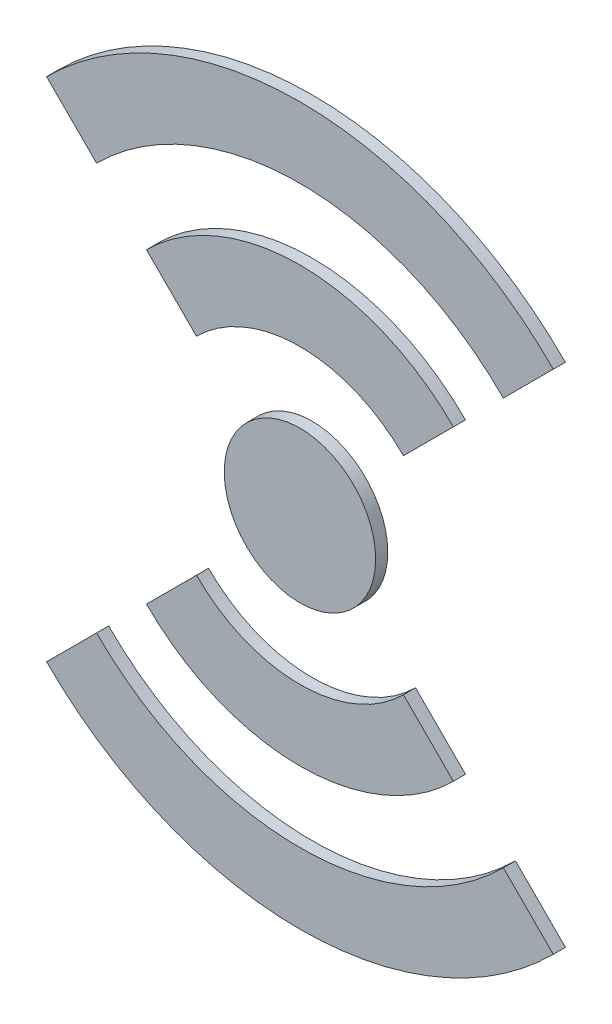
ISO-10303-21;
HEADER;
FILE_DESCRIPTION(('STEP AP214'),'2;1');
FILE_NAME('part.step','',(''),(''),'','','');
FILE_SCHEMA(('AUTOMOTIVE_DESIGN { 1 0 10303 214 1 1 1 1 }'));
ENDSEC;
DATA;
#1=APPLICATION_CONTEXT('core data for automotive mechanical design processes');
#2=APPLICATION_PROTOCOL_DEFINITION('international standard','automotive_design',2000,#1);
#3=PRODUCT_CONTEXT('',#1,'mechanical');
#4=PRODUCT('Part','Part','',(#3));
#5=PRODUCT_RELATED_PRODUCT_CATEGORY('part','',(#4));
#6=PRODUCT_DEFINITION_FORMATION('','',#4);
#7=PRODUCT_DEFINITION_CONTEXT('part definition',#1,'design');
#8=PRODUCT_DEFINITION('design','',#6,#7);
#9=PRODUCT_DEFINITION_SHAPE('','',#8);
#10=(LENGTH_UNIT() NAMED_UNIT(*) SI_UNIT(.MILLI.,.METRE.));
#11=(NAMED_UNIT(*) PLANE_ANGLE_UNIT() SI_UNIT($,.RADIAN.));
#12=(NAMED_UNIT(*) SI_UNIT($,.STERADIAN.) SOLID_ANGLE_UNIT());
#13=UNCERTAINTY_MEASURE_WITH_UNIT(LENGTH_MEASURE(1.E-05),#10,'distance_accuracy_value','');
#14=(GEOMETRIC_REPRESENTATION_CONTEXT(3) GLOBAL_UNCERTAINTY_ASSIGNED_CONTEXT((#13)) GLOBAL_UNIT_ASSIGNED_CONTEXT((#10,
#11,#12)) REPRESENTATION_CONTEXT('',''));
#15=CARTESIAN_POINT('',(0.,0.,0.));
#16=DIRECTION('',(0.,0.,1.));
#17=DIRECTION('',(1.,0.,0.));
#18=AXIS2_PLACEMENT_3D('',#15,#16,#17);
#19=CARTESIAN_POINT('',(0.,0.,1.2));
#20=DIRECTION('',(0.707106781186549,-0.707106781186546,0.));
#21=DIRECTION('',(0.707106781186546,0.707106781186549,0.));
#22=AXIS2_PLACEMENT_3D('',#19,#20,#21);
#23=PLANE('',#22);
#24=DIRECTION('',(-0.707106781186546,-0.707106781186549,0.));
#25=VECTOR('',#24,1.);
#26=CARTESIAN_POINT('',(0.,0.,0.));
#27=LINE('',#26,#25);
#28=CARTESIAN_POINT('',(-20.1525432638166,-20.1525432638166,0.));
#29=VERTEX_POINT('',#28);
#30=CARTESIAN_POINT('',(-25.1022907321224,-25.1022907321225,0.));
#31=VERTEX_POINT('',#30);
#32=EDGE_CURVE('E155',#29,#31,#27,.T.);
#33=ORIENTED_EDGE('',*,*,#32,.T.);
#34=DIRECTION('',(0.,0.,-1.));
#35=VECTOR('',#34,1.);
#36=CARTESIAN_POINT('',(-25.1022907321224,-25.1022907321225,1.2));
#37=LINE('',#36,#35);
#38=CARTESIAN_POINT('',(-25.1022907321224,-25.1022907321225,1.2));
#39=VERTEX_POINT('',#38);
#40=EDGE_CURVE('E13',#39,#31,#37,.T.);
#41=ORIENTED_EDGE('',*,*,#40,.F.);
#42=DIRECTION('',(-0.707106781186546,-0.707106781186549,0.));
#43=VECTOR('',#42,1.);
#44=CARTESIAN_POINT('',(0.,0.,1.2));
#45=LINE('',#44,#43);
#46=CARTESIAN_POINT('',(-20.1525432638166,-20.1525432638166,1.2));
#47=VERTEX_POINT('',#46);
#48=EDGE_CURVE('E141',#47,#39,#45,.T.);
#49=ORIENTED_EDGE('',*,*,#48,.F.);
#50=DIRECTION('',(0.,0.,-1.));
#51=VECTOR('',#50,1.);
#52=CARTESIAN_POINT('',(-20.1525432638166,-20.1525432638166,1.2));
#53=LINE('',#52,#51);
#54=EDGE_CURVE('E108',#47,#29,#53,.T.);
#55=ORIENTED_EDGE('',*,*,#54,.T.);
#56=EDGE_LOOP('',(#33,#41,#49,#55));
#57=FACE_BOUND('',#56,.T.);
#58=ADVANCED_FACE('F92',(#57),#23,.F.);
#59=CARTESIAN_POINT('',(0.,0.,1.2));
#60=DIRECTION('',(0.,0.,-1.));
#61=DIRECTION('',(-1.,0.,0.));
#62=AXIS2_PLACEMENT_3D('',#59,#60,#61);
#63=CYLINDRICAL_SURFACE('',#62,35.5);
#64=CARTESIAN_POINT('',(0.,0.,0.));
#65=DIRECTION('',(0.,0.,1.));
#66=DIRECTION('',(1.,0.,0.));
#67=AXIS2_PLACEMENT_3D('',#64,#65,#66);
#68=CIRCLE('',#67,35.5);
#69=CARTESIAN_POINT('',(25.1022907321226,-25.1022907321223,0.));
#70=VERTEX_POINT('',#69);
#71=EDGE_CURVE('E146',#31,#70,#68,.T.);
#72=ORIENTED_EDGE('',*,*,#71,.T.);
#73=DIRECTION('',(0.,0.,-1.));
#74=VECTOR('',#73,1.);
#75=CARTESIAN_POINT('',(25.1022907321226,-25.1022907321223,1.2));
#76=LINE('',#75,#74);
#77=CARTESIAN_POINT('',(25.1022907321226,-25.1022907321223,1.2));
#78=VERTEX_POINT('',#77);
#79=EDGE_CURVE('E100',#78,#70,#76,.T.);
#80=ORIENTED_EDGE('',*,*,#79,.F.);
#81=CARTESIAN_POINT('',(0.,0.,1.2));
#82=DIRECTION('',(0.,0.,1.));
#83=DIRECTION('',(1.,0.,0.));
#84=AXIS2_PLACEMENT_3D('',#81,#82,#83);
#85=CIRCLE('',#84,35.5);
#86=EDGE_CURVE('E133',#39,#78,#85,.T.);
#87=ORIENTED_EDGE('',*,*,#86,.F.);
#88=ORIENTED_EDGE('',*,*,#40,.T.);
#89=EDGE_LOOP('',(#72,#80,#87,#88));
#90=FACE_BOUND('',#89,.T.);
#91=ADVANCED_FACE('F145',(#90),#63,.T.);
#92=CARTESIAN_POINT('',(0.,0.,1.2));
#93=DIRECTION('',(0.707106781186544,0.707106781186551,0.));
#94=DIRECTION('',(-0.707106781186551,0.707106781186544,0.));
#95=AXIS2_PLACEMENT_3D('',#92,#93,#94);
#96=PLANE('',#95);
#97=DIRECTION('',(0.707106781186551,-0.707106781186544,0.));
#98=VECTOR('',#97,1.);
#99=CARTESIAN_POINT('',(0.,0.,0.));
#100=LINE('',#99,#98);
#101=CARTESIAN_POINT('',(20.1525432638167,-20.1525432638165,0.));
#102=VERTEX_POINT('',#101);
#103=EDGE_CURVE('E158',#102,#70,#100,.T.);
#104=ORIENTED_EDGE('',*,*,#103,.F.);
#105=DIRECTION('',(0.,0.,-1.));
#106=VECTOR('',#105,1.);
#107=CARTESIAN_POINT('',(20.1525432638167,-20.1525432638165,1.2));
#108=LINE('',#107,#106);
#109=CARTESIAN_POINT('',(20.1525432638167,-20.1525432638165,1.2));
#110=VERTEX_POINT('',#109);
#111=EDGE_CURVE('E122',#110,#102,#108,.T.);
#112=ORIENTED_EDGE('',*,*,#111,.F.);
#113=DIRECTION('',(0.707106781186551,-0.707106781186544,0.));
#114=VECTOR('',#113,1.);
#115=CARTESIAN_POINT('',(0.,0.,1.2));
#116=LINE('',#115,#114);
#117=EDGE_CURVE('E140',#110,#78,#116,.T.);
#118=ORIENTED_EDGE('',*,*,#117,.T.);
#119=ORIENTED_EDGE('',*,*,#79,.T.);
#120=EDGE_LOOP('',(#104,#112,#118,#119));
#121=FACE_BOUND('',#120,.T.);
#122=ADVANCED_FACE('F149',(#121),#96,.T.);
#123=CARTESIAN_POINT('',(0.,0.,1.2));
#124=DIRECTION('',(0.,0.,-1.));
#125=DIRECTION('',(-1.,0.,0.));
#126=AXIS2_PLACEMENT_3D('',#123,#124,#125);
#127=CYLINDRICAL_SURFACE('',#126,28.5);
#128=CARTESIAN_POINT('',(0.,0.,0.));
#129=DIRECTION('',(0.,0.,1.));
#130=DIRECTION('',(1.,0.,0.));
#131=AXIS2_PLACEMENT_3D('',#128,#129,#130);
#132=CIRCLE('',#131,28.5);
#133=EDGE_CURVE('E160',#29,#102,#132,.T.);
#134=ORIENTED_EDGE('',*,*,#133,.F.);
#135=ORIENTED_EDGE('',*,*,#54,.F.);
#136=CARTESIAN_POINT('',(0.,0.,1.2));
#137=DIRECTION('',(0.,0.,1.));
#138=DIRECTION('',(1.,0.,0.));
#139=AXIS2_PLACEMENT_3D('',#136,#137,#138);
#140=CIRCLE('',#139,28.5);
#141=EDGE_CURVE('E150',#47,#110,#140,.T.);
#142=ORIENTED_EDGE('',*,*,#141,.T.);
#143=ORIENTED_EDGE('',*,*,#111,.T.);
#144=EDGE_LOOP('',(#134,#135,#142,#143));
#145=FACE_BOUND('',#144,.T.);
#146=ADVANCED_FACE('F166',(#145),#127,.F.);
#147=CARTESIAN_POINT('',(0.,0.,1.2));
#148=DIRECTION('',(0.,0.,1.));
#149=DIRECTION('',(1.,0.,0.));
#150=AXIS2_PLACEMENT_3D('',#147,#148,#149);
#151=PLANE('',#150);
#152=ORIENTED_EDGE('',*,*,#48,.T.);
#153=ORIENTED_EDGE('',*,*,#86,.T.);
#154=ORIENTED_EDGE('',*,*,#117,.F.);
#155=ORIENTED_EDGE('',*,*,#141,.F.);
#156=EDGE_LOOP('',(#152,#153,#154,#155));
#157=FACE_BOUND('',#156,.T.);
#158=ADVANCED_FACE('F137',(#157),#151,.T.);
#159=CARTESIAN_POINT('',(0.,0.,0.));
#160=DIRECTION('',(0.,0.,1.));
#161=DIRECTION('',(1.,0.,0.));
#162=AXIS2_PLACEMENT_3D('',#159,#160,#161);
#163=PLANE('',#162);
#164=ORIENTED_EDGE('',*,*,#32,.F.);
#165=ORIENTED_EDGE('',*,*,#133,.T.);
#166=ORIENTED_EDGE('',*,*,#103,.T.);
#167=ORIENTED_EDGE('',*,*,#71,.F.);
#168=EDGE_LOOP('',(#164,#165,#166,#167));
#169=FACE_BOUND('',#168,.T.);
#170=ADVANCED_FACE('F165',(#169),#163,.F.);
#171=CLOSED_SHELL('',(#58,#91,#122,#146,#158,#170));
#172=MANIFOLD_SOLID_BREP('B2',#171);
#173=CARTESIAN_POINT('',(0.,0.,1.2));
#174=DIRECTION('',(-0.707106781186549,0.707106781186546,0.));
#175=DIRECTION('',(-0.707106781186546,-0.707106781186549,0.));
#176=AXIS2_PLACEMENT_3D('',#173,#174,#175);
#177=PLANE('',#176);
#178=DIRECTION('',(0.707106781186546,0.707106781186549,0.));
#179=VECTOR('',#178,1.);
#180=CARTESIAN_POINT('',(0.,0.,0.));
#181=LINE('',#180,#179);
#182=CARTESIAN_POINT('',(20.1525432638166,20.1525432638166,0.));
#183=VERTEX_POINT('',#182);
#184=CARTESIAN_POINT('',(25.1022907321224,25.1022907321225,0.));
#185=VERTEX_POINT('',#184);
#186=EDGE_CURVE('E289',#183,#185,#181,.T.);
#187=ORIENTED_EDGE('',*,*,#186,.T.);
#188=DIRECTION('',(0.,0.,-1.));
#189=VECTOR('',#188,1.);
#190=CARTESIAN_POINT('',(25.1022907321224,25.1022907321225,1.2));
#191=LINE('',#190,#189);
#192=CARTESIAN_POINT('',(25.1022907321224,25.1022907321225,1.2));
#193=VERTEX_POINT('',#192);
#194=EDGE_CURVE('E90',#193,#185,#191,.T.);
#195=ORIENTED_EDGE('',*,*,#194,.F.);
#196=DIRECTION('',(0.707106781186546,0.707106781186549,0.));
#197=VECTOR('',#196,1.);
#198=CARTESIAN_POINT('',(0.,0.,1.2));
#199=LINE('',#198,#197);
#200=CARTESIAN_POINT('',(20.1525432638166,20.1525432638166,1.2));
#201=VERTEX_POINT('',#200);
#202=EDGE_CURVE('E275',#201,#193,#199,.T.);
#203=ORIENTED_EDGE('',*,*,#202,.F.);
#204=DIRECTION('',(0.,0.,-1.));
#205=VECTOR('',#204,1.);
#206=CARTESIAN_POINT('',(20.1525432638166,20.1525432638166,1.2));
#207=LINE('',#206,#205);
#208=EDGE_CURVE('E242',#201,#183,#207,.T.);
#209=ORIENTED_EDGE('',*,*,#208,.T.);
#210=EDGE_LOOP('',(#187,#195,#203,#209));
#211=FACE_BOUND('',#210,.T.);
#212=ADVANCED_FACE('F226',(#211),#177,.F.);
#213=CARTESIAN_POINT('',(0.,0.,1.2));
#214=DIRECTION('',(0.,0.,-1.));
#215=DIRECTION('',(-1.,0.,0.));
#216=AXIS2_PLACEMENT_3D('',#213,#214,#215);
#217=CYLINDRICAL_SURFACE('',#216,35.5);
#218=CARTESIAN_POINT('',(0.,0.,0.));
#219=DIRECTION('',(0.,0.,1.));
#220=DIRECTION('',(1.,0.,0.));
#221=AXIS2_PLACEMENT_3D('',#218,#219,#220);
#222=CIRCLE('',#221,35.5);
#223=CARTESIAN_POINT('',(-25.1022907321226,25.1022907321223,0.));
#224=VERTEX_POINT('',#223);
#225=EDGE_CURVE('E280',#185,#224,#222,.T.);
#226=ORIENTED_EDGE('',*,*,#225,.T.);
#227=DIRECTION('',(0.,0.,-1.));
#228=VECTOR('',#227,1.);
#229=CARTESIAN_POINT('',(-25.1022907321226,25.1022907321223,1.2));
#230=LINE('',#229,#228);
#231=CARTESIAN_POINT('',(-25.1022907321226,25.1022907321223,1.2));
#232=VERTEX_POINT('',#231);
#233=EDGE_CURVE('E234',#232,#224,#230,.T.);
#234=ORIENTED_EDGE('',*,*,#233,.F.);
#235=CARTESIAN_POINT('',(0.,0.,1.2));
#236=DIRECTION('',(0.,0.,1.));
#237=DIRECTION('',(1.,0.,0.));
#238=AXIS2_PLACEMENT_3D('',#235,#236,#237);
#239=CIRCLE('',#238,35.5);
#240=EDGE_CURVE('E267',#193,#232,#239,.T.);
#241=ORIENTED_EDGE('',*,*,#240,.F.);
#242=ORIENTED_EDGE('',*,*,#194,.T.);
#243=EDGE_LOOP('',(#226,#234,#241,#242));
#244=FACE_BOUND('',#243,.T.);
#245=ADVANCED_FACE('F279',(#244),#217,.T.);
#246=CARTESIAN_POINT('',(0.,0.,1.2));
#247=DIRECTION('',(-0.707106781186544,-0.707106781186551,0.));
#248=DIRECTION('',(0.707106781186551,-0.707106781186544,0.));
#249=AXIS2_PLACEMENT_3D('',#246,#247,#248);
#250=PLANE('',#249);
#251=DIRECTION('',(-0.707106781186551,0.707106781186544,0.));
#252=VECTOR('',#251,1.);
#253=CARTESIAN_POINT('',(0.,0.,0.));
#254=LINE('',#253,#252);
#255=CARTESIAN_POINT('',(-20.1525432638167,20.1525432638165,0.));
#256=VERTEX_POINT('',#255);
#257=EDGE_CURVE('E292',#256,#224,#254,.T.);
#258=ORIENTED_EDGE('',*,*,#257,.F.);
#259=DIRECTION('',(0.,0.,-1.));
#260=VECTOR('',#259,1.);
#261=CARTESIAN_POINT('',(-20.1525432638167,20.1525432638165,1.2));
#262=LINE('',#261,#260);
#263=CARTESIAN_POINT('',(-20.1525432638167,20.1525432638165,1.2));
#264=VERTEX_POINT('',#263);
#265=EDGE_CURVE('E256',#264,#256,#262,.T.);
#266=ORIENTED_EDGE('',*,*,#265,.F.);
#267=DIRECTION('',(-0.707106781186551,0.707106781186544,0.));
#268=VECTOR('',#267,1.);
#269=CARTESIAN_POINT('',(0.,0.,1.2));
#270=LINE('',#269,#268);
#271=EDGE_CURVE('E274',#264,#232,#270,.T.);
#272=ORIENTED_EDGE('',*,*,#271,.T.);
#273=ORIENTED_EDGE('',*,*,#233,.T.);
#274=EDGE_LOOP('',(#258,#266,#272,#273));
#275=FACE_BOUND('',#274,.T.);
#276=ADVANCED_FACE('F283',(#275),#250,.T.);
#277=CARTESIAN_POINT('',(0.,0.,1.2));
#278=DIRECTION('',(0.,0.,-1.));
#279=DIRECTION('',(-1.,0.,0.));
#280=AXIS2_PLACEMENT_3D('',#277,#278,#279);
#281=CYLINDRICAL_SURFACE('',#280,28.5);
#282=CARTESIAN_POINT('',(0.,0.,0.));
#283=DIRECTION('',(0.,0.,1.));
#284=DIRECTION('',(1.,0.,0.));
#285=AXIS2_PLACEMENT_3D('',#282,#283,#284);
#286=CIRCLE('',#285,28.5);
#287=EDGE_CURVE('E294',#183,#256,#286,.T.);
#288=ORIENTED_EDGE('',*,*,#287,.F.);
#289=ORIENTED_EDGE('',*,*,#208,.F.);
#290=CARTESIAN_POINT('',(0.,0.,1.2));
#291=DIRECTION('',(0.,0.,1.));
#292=DIRECTION('',(1.,0.,0.));
#293=AXIS2_PLACEMENT_3D('',#290,#291,#292);
#294=CIRCLE('',#293,28.5);
#295=EDGE_CURVE('E284',#201,#264,#294,.T.);
#296=ORIENTED_EDGE('',*,*,#295,.T.);
#297=ORIENTED_EDGE('',*,*,#265,.T.);
#298=EDGE_LOOP('',(#288,#289,#296,#297));
#299=FACE_BOUND('',#298,.T.);
#300=ADVANCED_FACE('F300',(#299),#281,.F.);
#301=CARTESIAN_POINT('',(0.,0.,1.2));
#302=DIRECTION('',(0.,0.,1.));
#303=DIRECTION('',(1.,0.,0.));
#304=AXIS2_PLACEMENT_3D('',#301,#302,#303);
#305=PLANE('',#304);
#306=ORIENTED_EDGE('',*,*,#202,.T.);
#307=ORIENTED_EDGE('',*,*,#240,.T.);
#308=ORIENTED_EDGE('',*,*,#271,.F.);
#309=ORIENTED_EDGE('',*,*,#295,.F.);
#310=EDGE_LOOP('',(#306,#307,#308,#309));
#311=FACE_BOUND('',#310,.T.);
#312=ADVANCED_FACE('F271',(#311),#305,.T.);
#313=CARTESIAN_POINT('',(0.,0.,0.));
#314=DIRECTION('',(0.,0.,1.));
#315=DIRECTION('',(1.,0.,0.));
#316=AXIS2_PLACEMENT_3D('',#313,#314,#315);
#317=PLANE('',#316);
#318=ORIENTED_EDGE('',*,*,#186,.F.);
#319=ORIENTED_EDGE('',*,*,#287,.T.);
#320=ORIENTED_EDGE('',*,*,#257,.T.);
#321=ORIENTED_EDGE('',*,*,#225,.F.);
#322=EDGE_LOOP('',(#318,#319,#320,#321));
#323=FACE_BOUND('',#322,.T.);
#324=ADVANCED_FACE('F299',(#323),#317,.F.);
#325=CLOSED_SHELL('',(#212,#245,#276,#300,#312,#324));
#326=MANIFOLD_SOLID_BREP('B7',#325);
#327=CARTESIAN_POINT('',(0.,0.,1.2));
#328=DIRECTION('',(0.707106781186549,-0.707106781186546,0.));
#329=DIRECTION('',(0.707106781186546,0.707106781186549,0.));
#330=AXIS2_PLACEMENT_3D('',#327,#328,#329);
#331=PLANE('',#330);
#332=DIRECTION('',(-0.707106781186546,-0.707106781186549,0.));
#333=VECTOR('',#332,1.);
#334=CARTESIAN_POINT('',(0.,0.,0.));
#335=LINE('',#334,#333);
#336=CARTESIAN_POINT('',(-10.2530483272049,-10.253048327205,0.));
#337=VERTEX_POINT('',#336);
#338=CARTESIAN_POINT('',(-15.2027957955107,-15.2027957955108,0.));
#339=VERTEX_POINT('',#338);
#340=EDGE_CURVE('E429',#337,#339,#335,.T.);
#341=ORIENTED_EDGE('',*,*,#340,.T.);
#342=DIRECTION('',(0.,0.,-1.));
#343=VECTOR('',#342,1.);
#344=CARTESIAN_POINT('',(-15.2027957955107,-15.2027957955108,1.2));
#345=LINE('',#344,#343);
#346=CARTESIAN_POINT('',(-15.2027957955107,-15.2027957955108,1.2));
#347=VERTEX_POINT('',#346);
#348=EDGE_CURVE('E224',#347,#339,#345,.T.);
#349=ORIENTED_EDGE('',*,*,#348,.F.);
#350=DIRECTION('',(-0.707106781186546,-0.707106781186549,0.));
#351=VECTOR('',#350,1.);
#352=CARTESIAN_POINT('',(0.,0.,1.2));
#353=LINE('',#352,#351);
#354=CARTESIAN_POINT('',(-10.2530483272049,-10.253048327205,1.2));
#355=VERTEX_POINT('',#354);
#356=EDGE_CURVE('E415',#355,#347,#353,.T.);
#357=ORIENTED_EDGE('',*,*,#356,.F.);
#358=DIRECTION('',(0.,0.,-1.));
#359=VECTOR('',#358,1.);
#360=CARTESIAN_POINT('',(-10.2530483272049,-10.253048327205,1.2));
#361=LINE('',#360,#359);
#362=EDGE_CURVE('E382',#355,#337,#361,.T.);
#363=ORIENTED_EDGE('',*,*,#362,.T.);
#364=EDGE_LOOP('',(#341,#349,#357,#363));
#365=FACE_BOUND('',#364,.T.);
#366=ADVANCED_FACE('F366',(#365),#331,.F.);
#367=CARTESIAN_POINT('',(0.,0.,1.2));
#368=DIRECTION('',(0.,0.,-1.));
#369=DIRECTION('',(-1.,0.,0.));
#370=AXIS2_PLACEMENT_3D('',#367,#368,#369);
#371=CYLINDRICAL_SURFACE('',#370,21.5);
#372=CARTESIAN_POINT('',(0.,0.,0.));
#373=DIRECTION('',(0.,0.,1.));
#374=DIRECTION('',(1.,0.,0.));
#375=AXIS2_PLACEMENT_3D('',#372,#373,#374);
#376=CIRCLE('',#375,21.5);
#377=CARTESIAN_POINT('',(15.2027957955109,-15.2027957955107,0.));
#378=VERTEX_POINT('',#377);
#379=EDGE_CURVE('E420',#339,#378,#376,.T.);
#380=ORIENTED_EDGE('',*,*,#379,.T.);
#381=DIRECTION('',(0.,0.,-1.));
#382=VECTOR('',#381,1.);
#383=CARTESIAN_POINT('',(15.2027957955109,-15.2027957955107,1.2));
#384=LINE('',#383,#382);
#385=CARTESIAN_POINT('',(15.2027957955109,-15.2027957955107,1.2));
#386=VERTEX_POINT('',#385);
#387=EDGE_CURVE('E374',#386,#378,#384,.T.);
#388=ORIENTED_EDGE('',*,*,#387,.F.);
#389=CARTESIAN_POINT('',(0.,0.,1.2));
#390=DIRECTION('',(0.,0.,1.));
#391=DIRECTION('',(1.,0.,0.));
#392=AXIS2_PLACEMENT_3D('',#389,#390,#391);
#393=CIRCLE('',#392,21.5);
#394=EDGE_CURVE('E407',#347,#386,#393,.T.);
#395=ORIENTED_EDGE('',*,*,#394,.F.);
#396=ORIENTED_EDGE('',*,*,#348,.T.);
#397=EDGE_LOOP('',(#380,#388,#395,#396));
#398=FACE_BOUND('',#397,.T.);
#399=ADVANCED_FACE('F419',(#398),#371,.T.);
#400=CARTESIAN_POINT('',(0.,0.,1.2));
#401=DIRECTION('',(0.707106781186544,0.707106781186551,0.));
#402=DIRECTION('',(-0.707106781186551,0.707106781186544,0.));
#403=AXIS2_PLACEMENT_3D('',#400,#401,#402);
#404=PLANE('',#403);
#405=DIRECTION('',(0.707106781186551,-0.707106781186544,0.));
#406=VECTOR('',#405,1.);
#407=CARTESIAN_POINT('',(0.,0.,0.));
#408=LINE('',#407,#406);
#409=CARTESIAN_POINT('',(10.253048327205,-10.2530483272049,0.));
#410=VERTEX_POINT('',#409);
#411=EDGE_CURVE('E432',#410,#378,#408,.T.);
#412=ORIENTED_EDGE('',*,*,#411,.F.);
#413=DIRECTION('',(0.,0.,-1.));
#414=VECTOR('',#413,1.);
#415=CARTESIAN_POINT('',(10.253048327205,-10.2530483272049,1.2));
#416=LINE('',#415,#414);
#417=CARTESIAN_POINT('',(10.253048327205,-10.2530483272049,1.2));
#418=VERTEX_POINT('',#417);
#419=EDGE_CURVE('E396',#418,#410,#416,.T.);
#420=ORIENTED_EDGE('',*,*,#419,.F.);
#421=DIRECTION('',(0.707106781186551,-0.707106781186544,0.));
#422=VECTOR('',#421,1.);
#423=CARTESIAN_POINT('',(0.,0.,1.2));
#424=LINE('',#423,#422);
#425=EDGE_CURVE('E414',#418,#386,#424,.T.);
#426=ORIENTED_EDGE('',*,*,#425,.T.);
#427=ORIENTED_EDGE('',*,*,#387,.T.);
#428=EDGE_LOOP('',(#412,#420,#426,#427));
#429=FACE_BOUND('',#428,.T.);
#430=ADVANCED_FACE('F423',(#429),#404,.T.);
#431=CARTESIAN_POINT('',(0.,0.,1.2));
#432=DIRECTION('',(0.,0.,-1.));
#433=DIRECTION('',(-1.,0.,0.));
#434=AXIS2_PLACEMENT_3D('',#431,#432,#433);
#435=CYLINDRICAL_SURFACE('',#434,14.5);
#436=CARTESIAN_POINT('',(0.,0.,0.));
#437=DIRECTION('',(0.,0.,1.));
#438=DIRECTION('',(1.,0.,0.));
#439=AXIS2_PLACEMENT_3D('',#436,#437,#438);
#440=CIRCLE('',#439,14.5);
#441=EDGE_CURVE('E434',#337,#410,#440,.T.);
#442=ORIENTED_EDGE('',*,*,#441,.F.);
#443=ORIENTED_EDGE('',*,*,#362,.F.);
#444=CARTESIAN_POINT('',(0.,0.,1.2));
#445=DIRECTION('',(0.,0.,1.));
#446=DIRECTION('',(1.,0.,0.));
#447=AXIS2_PLACEMENT_3D('',#444,#445,#446);
#448=CIRCLE('',#447,14.5);
#449=EDGE_CURVE('E424',#355,#418,#448,.T.);
#450=ORIENTED_EDGE('',*,*,#449,.T.);
#451=ORIENTED_EDGE('',*,*,#419,.T.);
#452=EDGE_LOOP('',(#442,#443,#450,#451));
#453=FACE_BOUND('',#452,.T.);
#454=ADVANCED_FACE('F440',(#453),#435,.F.);
#455=CARTESIAN_POINT('',(0.,0.,1.2));
#456=DIRECTION('',(0.,0.,1.));
#457=DIRECTION('',(1.,0.,0.));
#458=AXIS2_PLACEMENT_3D('',#455,#456,#457);
#459=PLANE('',#458);
#460=ORIENTED_EDGE('',*,*,#356,.T.);
#461=ORIENTED_EDGE('',*,*,#394,.T.);
#462=ORIENTED_EDGE('',*,*,#425,.F.);
#463=ORIENTED_EDGE('',*,*,#449,.F.);
#464=EDGE_LOOP('',(#460,#461,#462,#463));
#465=FACE_BOUND('',#464,.T.);
#466=ADVANCED_FACE('F411',(#465),#459,.T.);
#467=CARTESIAN_POINT('',(0.,0.,0.));
#468=DIRECTION('',(0.,0.,1.));
#469=DIRECTION('',(1.,0.,0.));
#470=AXIS2_PLACEMENT_3D('',#467,#468,#469);
#471=PLANE('',#470);
#472=ORIENTED_EDGE('',*,*,#340,.F.);
#473=ORIENTED_EDGE('',*,*,#441,.T.);
#474=ORIENTED_EDGE('',*,*,#411,.T.);
#475=ORIENTED_EDGE('',*,*,#379,.F.);
#476=EDGE_LOOP('',(#472,#473,#474,#475));
#477=FACE_BOUND('',#476,.T.);
#478=ADVANCED_FACE('F439',(#477),#471,.F.);
#479=CLOSED_SHELL('',(#366,#399,#430,#454,#466,#478));
#480=MANIFOLD_SOLID_BREP('B84',#479);
#481=CARTESIAN_POINT('',(0.,0.,1.2));
#482=DIRECTION('',(-0.707106781186549,0.707106781186546,0.));
#483=DIRECTION('',(-0.707106781186546,-0.707106781186549,0.));
#484=AXIS2_PLACEMENT_3D('',#481,#482,#483);
#485=PLANE('',#484);
#486=DIRECTION('',(0.707106781186546,0.707106781186549,0.));
#487=VECTOR('',#486,1.);
#488=CARTESIAN_POINT('',(0.,0.,0.));
#489=LINE('',#488,#487);
#490=CARTESIAN_POINT('',(10.2530483272049,10.253048327205,0.));
#491=VERTEX_POINT('',#490);
#492=CARTESIAN_POINT('',(15.2027957955107,15.2027957955108,0.));
#493=VERTEX_POINT('',#492);
#494=EDGE_CURVE('E560',#491,#493,#489,.T.);
#495=ORIENTED_EDGE('',*,*,#494,.T.);
#496=DIRECTION('',(0.,0.,-1.));
#497=VECTOR('',#496,1.);
#498=CARTESIAN_POINT('',(15.2027957955107,15.2027957955108,1.2));
#499=LINE('',#498,#497);
#500=CARTESIAN_POINT('',(15.2027957955107,15.2027957955108,1.2));
#501=VERTEX_POINT('',#500);
#502=EDGE_CURVE('E364',#501,#493,#499,.T.);
#503=ORIENTED_EDGE('',*,*,#502,.F.);
#504=DIRECTION('',(0.707106781186546,0.707106781186549,0.));
#505=VECTOR('',#504,1.);
#506=CARTESIAN_POINT('',(0.,0.,1.2));
#507=LINE('',#506,#505);
#508=CARTESIAN_POINT('',(10.2530483272049,10.253048327205,1.2));
#509=VERTEX_POINT('',#508);
#510=EDGE_CURVE('E546',#509,#501,#507,.T.);
#511=ORIENTED_EDGE('',*,*,#510,.F.);
#512=DIRECTION('',(0.,0.,-1.));
#513=VECTOR('',#512,1.);
#514=CARTESIAN_POINT('',(10.2530483272049,10.253048327205,1.2));
#515=LINE('',#514,#513);
#516=EDGE_CURVE('E513',#509,#491,#515,.T.);
#517=ORIENTED_EDGE('',*,*,#516,.T.);
#518=EDGE_LOOP('',(#495,#503,#511,#517));
#519=FACE_BOUND('',#518,.T.);
#520=ADVANCED_FACE('F497',(#519),#485,.F.);
#521=CARTESIAN_POINT('',(0.,0.,1.2));
#522=DIRECTION('',(0.,0.,-1.));
#523=DIRECTION('',(-1.,0.,0.));
#524=AXIS2_PLACEMENT_3D('',#521,#522,#523);
#525=CYLINDRICAL_SURFACE('',#524,21.5);
#526=CARTESIAN_POINT('',(0.,0.,0.));
#527=DIRECTION('',(0.,0.,1.));
#528=DIRECTION('',(1.,0.,0.));
#529=AXIS2_PLACEMENT_3D('',#526,#527,#528);
#530=CIRCLE('',#529,21.5);
#531=CARTESIAN_POINT('',(-15.2027957955109,15.2027957955107,0.));
#532=VERTEX_POINT('',#531);
#533=EDGE_CURVE('E551',#493,#532,#530,.T.);
#534=ORIENTED_EDGE('',*,*,#533,.T.);
#535=DIRECTION('',(0.,0.,-1.));
#536=VECTOR('',#535,1.);
#537=CARTESIAN_POINT('',(-15.2027957955109,15.2027957955107,1.2));
#538=LINE('',#537,#536);
#539=CARTESIAN_POINT('',(-15.2027957955109,15.2027957955107,1.2));
#540=VERTEX_POINT('',#539);
#541=EDGE_CURVE('E505',#540,#532,#538,.T.);
#542=ORIENTED_EDGE('',*,*,#541,.F.);
#543=CARTESIAN_POINT('',(0.,0.,1.2));
#544=DIRECTION('',(0.,0.,1.));
#545=DIRECTION('',(1.,0.,0.));
#546=AXIS2_PLACEMENT_3D('',#543,#544,#545);
#547=CIRCLE('',#546,21.5);
#548=EDGE_CURVE('E538',#501,#540,#547,.T.);
#549=ORIENTED_EDGE('',*,*,#548,.F.);
#550=ORIENTED_EDGE('',*,*,#502,.T.);
#551=EDGE_LOOP('',(#534,#542,#549,#550));
#552=FACE_BOUND('',#551,.T.);
#553=ADVANCED_FACE('F550',(#552),#525,.T.);
#554=CARTESIAN_POINT('',(0.,0.,1.2));
#555=DIRECTION('',(-0.707106781186544,-0.707106781186551,0.));
#556=DIRECTION('',(0.707106781186551,-0.707106781186544,0.));
#557=AXIS2_PLACEMENT_3D('',#554,#555,#556);
#558=PLANE('',#557);
#559=DIRECTION('',(-0.707106781186551,0.707106781186544,0.));
#560=VECTOR('',#559,1.);
#561=CARTESIAN_POINT('',(0.,0.,0.));
#562=LINE('',#561,#560);
#563=CARTESIAN_POINT('',(-10.253048327205,10.2530483272049,0.));
#564=VERTEX_POINT('',#563);
#565=EDGE_CURVE('E563',#564,#532,#562,.T.);
#566=ORIENTED_EDGE('',*,*,#565,.F.);
#567=DIRECTION('',(0.,0.,-1.));
#568=VECTOR('',#567,1.);
#569=CARTESIAN_POINT('',(-10.253048327205,10.2530483272049,1.2));
#570=LINE('',#569,#568);
#571=CARTESIAN_POINT('',(-10.253048327205,10.2530483272049,1.2));
#572=VERTEX_POINT('',#571);
#573=EDGE_CURVE('E527',#572,#564,#570,.T.);
#574=ORIENTED_EDGE('',*,*,#573,.F.);
#575=DIRECTION('',(-0.707106781186551,0.707106781186544,0.));
#576=VECTOR('',#575,1.);
#577=CARTESIAN_POINT('',(0.,0.,1.2));
#578=LINE('',#577,#576);
#579=EDGE_CURVE('E545',#572,#540,#578,.T.);
#580=ORIENTED_EDGE('',*,*,#579,.T.);
#581=ORIENTED_EDGE('',*,*,#541,.T.);
#582=EDGE_LOOP('',(#566,#574,#580,#581));
#583=FACE_BOUND('',#582,.T.);
#584=ADVANCED_FACE('F554',(#583),#558,.T.);
#585=CARTESIAN_POINT('',(0.,0.,1.2));
#586=DIRECTION('',(0.,0.,-1.));
#587=DIRECTION('',(-1.,0.,0.));
#588=AXIS2_PLACEMENT_3D('',#585,#586,#587);
#589=CYLINDRICAL_SURFACE('',#588,14.5);
#590=CARTESIAN_POINT('',(0.,0.,0.));
#591=DIRECTION('',(0.,0.,1.));
#592=DIRECTION('',(1.,0.,0.));
#593=AXIS2_PLACEMENT_3D('',#590,#591,#592);
#594=CIRCLE('',#593,14.5);
#595=EDGE_CURVE('E565',#491,#564,#594,.T.);
#596=ORIENTED_EDGE('',*,*,#595,.F.);
#597=ORIENTED_EDGE('',*,*,#516,.F.);
#598=CARTESIAN_POINT('',(0.,0.,1.2));
#599=DIRECTION('',(0.,0.,1.));
#600=DIRECTION('',(1.,0.,0.));
#601=AXIS2_PLACEMENT_3D('',#598,#599,#600);
#602=CIRCLE('',#601,14.5);
#603=EDGE_CURVE('E555',#509,#572,#602,.T.);
#604=ORIENTED_EDGE('',*,*,#603,.T.);
#605=ORIENTED_EDGE('',*,*,#573,.T.);
#606=EDGE_LOOP('',(#596,#597,#604,#605));
#607=FACE_BOUND('',#606,.T.);
#608=ADVANCED_FACE('F571',(#607),#589,.F.);
#609=CARTESIAN_POINT('',(0.,0.,1.2));
#610=DIRECTION('',(0.,0.,1.));
#611=DIRECTION('',(1.,0.,0.));
#612=AXIS2_PLACEMENT_3D('',#609,#610,#611);
#613=PLANE('',#612);
#614=ORIENTED_EDGE('',*,*,#510,.T.);
#615=ORIENTED_EDGE('',*,*,#548,.T.);
#616=ORIENTED_EDGE('',*,*,#579,.F.);
#617=ORIENTED_EDGE('',*,*,#603,.F.);
#618=EDGE_LOOP('',(#614,#615,#616,#617));
#619=FACE_BOUND('',#618,.T.);
#620=ADVANCED_FACE('F542',(#619),#613,.T.);
#621=CARTESIAN_POINT('',(0.,0.,0.));
#622=DIRECTION('',(0.,0.,1.));
#623=DIRECTION('',(1.,0.,0.));
#624=AXIS2_PLACEMENT_3D('',#621,#622,#623);
#625=PLANE('',#624);
#626=ORIENTED_EDGE('',*,*,#494,.F.);
#627=ORIENTED_EDGE('',*,*,#595,.T.);
#628=ORIENTED_EDGE('',*,*,#565,.T.);
#629=ORIENTED_EDGE('',*,*,#533,.F.);
#630=EDGE_LOOP('',(#626,#627,#628,#629));
#631=FACE_BOUND('',#630,.T.);
#632=ADVANCED_FACE('F570',(#631),#625,.F.);
#633=CLOSED_SHELL('',(#520,#553,#584,#608,#620,#632));
#634=MANIFOLD_SOLID_BREP('B218',#633);
#635=CARTESIAN_POINT('',(0.,0.,1.2));
#636=DIRECTION('',(0.,0.,-1.));
#637=DIRECTION('',(-1.,0.,0.));
#638=AXIS2_PLACEMENT_3D('',#635,#636,#637);
#639=CYLINDRICAL_SURFACE('',#638,7.5);
#640=CARTESIAN_POINT('',(0.,0.,1.2));
#641=DIRECTION('',(0.,0.,1.));
#642=DIRECTION('',(1.,0.,0.));
#643=AXIS2_PLACEMENT_3D('',#640,#641,#642);
#644=CIRCLE('',#643,7.5);
#645=CARTESIAN_POINT('',(7.5,0.,1.2));
#646=VERTEX_POINT('',#645);
#647=EDGE_CURVE('E496',#646,#646,#644,.T.);
#648=ORIENTED_EDGE('',*,*,#647,.F.);
#649=EDGE_LOOP('',(#648));
#650=FACE_BOUND('',#649,.T.);
#651=CARTESIAN_POINT('',(0.,0.,0.));
#652=DIRECTION('',(0.,0.,1.));
#653=DIRECTION('',(1.,0.,0.));
#654=AXIS2_PLACEMENT_3D('',#651,#652,#653);
#655=CIRCLE('',#654,7.5);
#656=CARTESIAN_POINT('',(7.5,0.,0.));
#657=VERTEX_POINT('',#656);
#658=EDGE_CURVE('E630',#657,#657,#655,.T.);
#659=ORIENTED_EDGE('',*,*,#658,.T.);
#660=EDGE_LOOP('',(#659));
#661=FACE_BOUND('',#660,.T.);
#662=ADVANCED_FACE('F627',(#650,#661),#639,.T.);
#663=CARTESIAN_POINT('',(0.,0.,1.2));
#664=DIRECTION('',(0.,0.,1.));
#665=DIRECTION('',(1.,0.,0.));
#666=AXIS2_PLACEMENT_3D('',#663,#664,#665);
#667=PLANE('',#666);
#668=ORIENTED_EDGE('',*,*,#647,.T.);
#669=EDGE_LOOP('',(#668));
#670=FACE_BOUND('',#669,.T.);
#671=ADVANCED_FACE('F642',(#670),#667,.T.);
#672=CARTESIAN_POINT('',(0.,0.,0.));
#673=DIRECTION('',(0.,0.,1.));
#674=DIRECTION('',(1.,0.,0.));
#675=AXIS2_PLACEMENT_3D('',#672,#673,#674);
#676=PLANE('',#675);
#677=ORIENTED_EDGE('',*,*,#658,.F.);
#678=EDGE_LOOP('',(#677));
#679=FACE_BOUND('',#678,.T.);
#680=ADVANCED_FACE('F640',(#679),#676,.F.);
#681=CLOSED_SHELL('',(#662,#671,#680));
#682=MANIFOLD_SOLID_BREP('B358',#681);
#683=ADVANCED_BREP_SHAPE_REPRESENTATION('',(#18,#172,#326,#480,#634,#682),#14);
#684=SHAPE_DEFINITION_REPRESENTATION(#9,#683);
ENDSEC;
END-ISO-10303-21;
